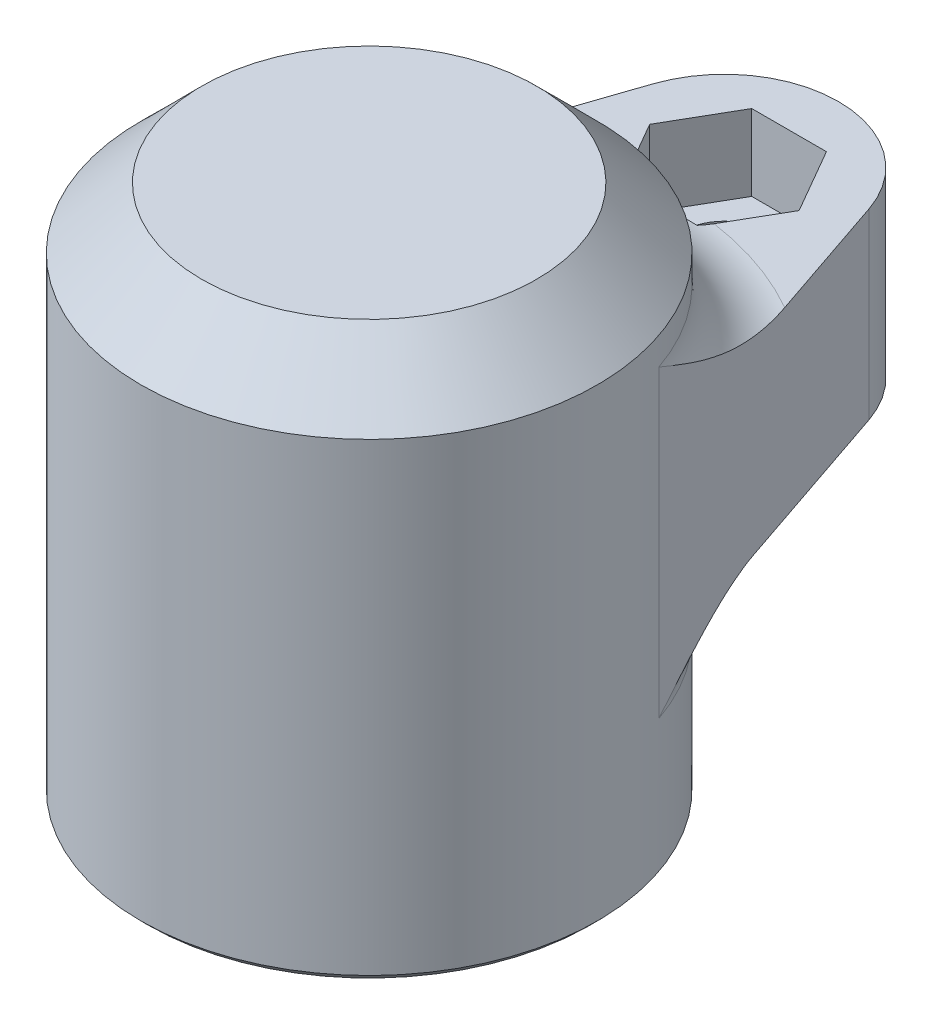
ISO-10303-21;
HEADER;
FILE_DESCRIPTION(('STEP AP214'),'2;1');
FILE_NAME('part.step','',(''),(''),'','','');
FILE_SCHEMA(('AUTOMOTIVE_DESIGN { 1 0 10303 214 1 1 1 1 }'));
ENDSEC;
DATA;
#1=APPLICATION_CONTEXT('core data for automotive mechanical design processes');
#2=APPLICATION_PROTOCOL_DEFINITION('international standard','automotive_design',2000,#1);
#3=PRODUCT_CONTEXT('',#1,'mechanical');
#4=PRODUCT('Part','Part','',(#3));
#5=PRODUCT_RELATED_PRODUCT_CATEGORY('part','',(#4));
#6=PRODUCT_DEFINITION_FORMATION('','',#4);
#7=PRODUCT_DEFINITION_CONTEXT('part definition',#1,'design');
#8=PRODUCT_DEFINITION('design','',#6,#7);
#9=PRODUCT_DEFINITION_SHAPE('','',#8);
#10=(LENGTH_UNIT() NAMED_UNIT(*) SI_UNIT(.MILLI.,.METRE.));
#11=(NAMED_UNIT(*) PLANE_ANGLE_UNIT() SI_UNIT($,.RADIAN.));
#12=(NAMED_UNIT(*) SI_UNIT($,.STERADIAN.) SOLID_ANGLE_UNIT());
#13=UNCERTAINTY_MEASURE_WITH_UNIT(LENGTH_MEASURE(1.E-05),#10,'distance_accuracy_value','');
#14=(GEOMETRIC_REPRESENTATION_CONTEXT(3) GLOBAL_UNCERTAINTY_ASSIGNED_CONTEXT((#13)) GLOBAL_UNIT_ASSIGNED_CONTEXT((#10,
#11,#12)) REPRESENTATION_CONTEXT('',''));
#15=CARTESIAN_POINT('',(0.,0.,0.));
#16=DIRECTION('',(0.,0.,1.));
#17=DIRECTION('',(1.,0.,0.));
#18=AXIS2_PLACEMENT_3D('',#15,#16,#17);
#19=CARTESIAN_POINT('',(0.,12.2,-23.3362854192114));
#20=DIRECTION('',(0.,1.,0.));
#21=DIRECTION('',(0.,0.,1.));
#22=AXIS2_PLACEMENT_3D('',#19,#20,#21);
#23=PLANE('',#22);
#24=DIRECTION('',(-0.321387910083826,0.,-0.946947628568735));
#25=VECTOR('',#24,1.);
#26=CARTESIAN_POINT('',(7.10210721426551,12.2,-25.7466947448401));
#27=LINE('',#26,#25);
#28=CARTESIAN_POINT('',(11.0064450988174,12.2,-14.2428285914954));
#29=VERTEX_POINT('',#28);
#30=CARTESIAN_POINT('',(7.10210721426551,12.2,-25.7466947448401));
#31=VERTEX_POINT('',#30);
#32=EDGE_CURVE('E213',#29,#31,#27,.T.);
#33=ORIENTED_EDGE('',*,*,#32,.F.);
#34=CARTESIAN_POINT('',(0.,12.2,0.));
#35=DIRECTION('',(0.,1.,0.));
#36=DIRECTION('',(0.,0.,1.));
#37=AXIS2_PLACEMENT_3D('',#34,#35,#36);
#38=CIRCLE('',#37,18.);
#39=CARTESIAN_POINT('',(4.59008360968517,12.2,-17.404916904602));
#40=VERTEX_POINT('',#39);
#41=EDGE_CURVE('E290',#29,#40,#38,.T.);
#42=ORIENTED_EDGE('',*,*,#41,.T.);
#43=CARTESIAN_POINT('',(0.,12.2,-23.3362854192114));
#44=DIRECTION('',(0.,-1.,0.));
#45=DIRECTION('',(0.,0.,1.));
#46=AXIS2_PLACEMENT_3D('',#43,#44,#45);
#47=CIRCLE('',#46,7.5);
#48=EDGE_CURVE('E207',#31,#40,#47,.T.);
#49=ORIENTED_EDGE('',*,*,#48,.F.);
#50=EDGE_LOOP('',(#33,#42,#49));
#51=FACE_BOUND('',#50,.T.);
#52=ADVANCED_FACE('F37',(#51),#23,.F.);
#53=CARTESIAN_POINT('',(0.,24.2,-23.3362854192114));
#54=DIRECTION('',(0.,1.,0.));
#55=DIRECTION('',(0.,0.,1.));
#56=AXIS2_PLACEMENT_3D('',#53,#54,#55);
#57=PLANE('',#56);
#58=DIRECTION('',(0.5,0.,0.866025403784439));
#59=VECTOR('',#58,1.);
#60=CARTESIAN_POINT('',(3.68060796608386,24.2,-25.4612854192114));
#61=LINE('',#60,#59);
#62=CARTESIAN_POINT('',(2.4537386440559,24.2,-27.5862854192114));
#63=VERTEX_POINT('',#62);
#64=CARTESIAN_POINT('',(4.90747728811182,24.2,-23.3362854192114));
#65=VERTEX_POINT('',#64);
#66=EDGE_CURVE('E341',#63,#65,#61,.T.);
#67=ORIENTED_EDGE('',*,*,#66,.T.);
#68=DIRECTION('',(-0.5,0.,0.866025403784439));
#69=VECTOR('',#68,1.);
#70=CARTESIAN_POINT('',(3.68060796608387,24.2,-21.2112854192114));
#71=LINE('',#70,#69);
#72=CARTESIAN_POINT('',(2.86239957666177,24.2,-19.7941069175532));
#73=VERTEX_POINT('',#72);
#74=EDGE_CURVE('E153',#65,#73,#71,.T.);
#75=ORIENTED_EDGE('',*,*,#74,.T.);
#76=CARTESIAN_POINT('',(0.,24.2,0.));
#77=DIRECTION('',(0.,1.,0.));
#78=DIRECTION('',(0.,0.,1.));
#79=AXIS2_PLACEMENT_3D('',#76,#77,#78);
#80=CIRCLE('',#79,20.);
#81=CARTESIAN_POINT('',(9.95265200620806,24.2,-17.3477583002336));
#82=VERTEX_POINT('',#81);
#83=EDGE_CURVE('E241',#73,#82,#80,.F.);
#84=ORIENTED_EDGE('',*,*,#83,.T.);
#85=DIRECTION('',(-0.321387910083826,0.,-0.946947628568735));
#86=VECTOR('',#85,1.);
#87=CARTESIAN_POINT('',(7.10210721426551,24.2,-25.7466947448401));
#88=LINE('',#87,#86);
#89=CARTESIAN_POINT('',(7.10210721426551,24.2,-25.7466947448401));
#90=VERTEX_POINT('',#89);
#91=EDGE_CURVE('E218',#82,#90,#88,.T.);
#92=ORIENTED_EDGE('',*,*,#91,.T.);
#93=CARTESIAN_POINT('',(0.,24.2,-23.3362854192114));
#94=DIRECTION('',(0.,1.,0.));
#95=DIRECTION('',(0.,0.,1.));
#96=AXIS2_PLACEMENT_3D('',#93,#94,#95);
#97=CIRCLE('',#96,7.5);
#98=CARTESIAN_POINT('',(-7.10210721426551,24.2,-25.7466947448401));
#99=VERTEX_POINT('',#98);
#100=EDGE_CURVE('E198',#90,#99,#97,.T.);
#101=ORIENTED_EDGE('',*,*,#100,.T.);
#102=DIRECTION('',(-0.321387910083826,0.,0.946947628568735));
#103=VECTOR('',#102,1.);
#104=CARTESIAN_POINT('',(-7.10210721426551,24.2,-25.7466947448401));
#105=LINE('',#104,#103);
#106=CARTESIAN_POINT('',(-9.95265200620807,24.2,-17.3477583002336));
#107=VERTEX_POINT('',#106);
#108=EDGE_CURVE('E206',#99,#107,#105,.T.);
#109=ORIENTED_EDGE('',*,*,#108,.T.);
#110=CARTESIAN_POINT('',(-2.86239957666177,24.2,-19.7941069175532));
#111=VERTEX_POINT('',#110);
#112=EDGE_CURVE('E242',#107,#111,#80,.F.);
#113=ORIENTED_EDGE('',*,*,#112,.T.);
#114=DIRECTION('',(-0.5,0.,-0.866025403784439));
#115=VECTOR('',#114,1.);
#116=CARTESIAN_POINT('',(-3.68060796608387,24.2,-21.2112854192114));
#117=LINE('',#116,#115);
#118=CARTESIAN_POINT('',(-4.90747728811182,24.2,-23.3362854192114));
#119=VERTEX_POINT('',#118);
#120=EDGE_CURVE('E156',#111,#119,#117,.T.);
#121=ORIENTED_EDGE('',*,*,#120,.T.);
#122=DIRECTION('',(0.5,0.,-0.866025403784439));
#123=VECTOR('',#122,1.);
#124=CARTESIAN_POINT('',(-3.68060796608387,24.2,-25.4612854192114));
#125=LINE('',#124,#123);
#126=CARTESIAN_POINT('',(-2.45373864405591,24.2,-27.5862854192114));
#127=VERTEX_POINT('',#126);
#128=EDGE_CURVE('E346',#119,#127,#125,.T.);
#129=ORIENTED_EDGE('',*,*,#128,.T.);
#130=DIRECTION('',(1.,0.,0.));
#131=VECTOR('',#130,1.);
#132=CARTESIAN_POINT('',(0.,24.2,-27.5862854192114));
#133=LINE('',#132,#131);
#134=EDGE_CURVE('E343',#127,#63,#133,.T.);
#135=ORIENTED_EDGE('',*,*,#134,.T.);
#136=EDGE_LOOP('',(#67,#75,#84,#92,#101,#109,#113,#121,#129,#135));
#137=FACE_BOUND('',#136,.T.);
#138=ADVANCED_FACE('F273',(#137),#57,.T.);
#139=CARTESIAN_POINT('',(0.,9.19999999999998,-23.3362854192114));
#140=DIRECTION('',(0.,1.,0.));
#141=DIRECTION('',(0.,0.,1.));
#142=AXIS2_PLACEMENT_3D('',#139,#140,#141);
#143=CYLINDRICAL_SURFACE('',#142,2.75);
#144=CARTESIAN_POINT('',(0.,9.19999999999998,-23.3362854192114));
#145=DIRECTION('',(0.,1.,0.));
#146=DIRECTION('',(0.,0.,1.));
#147=AXIS2_PLACEMENT_3D('',#144,#145,#146);
#148=CIRCLE('',#147,2.75);
#149=CARTESIAN_POINT('',(0.,9.19999999999998,-20.5862854192114));
#150=VERTEX_POINT('',#149);
#151=EDGE_CURVE('E195',#150,#150,#148,.T.);
#152=ORIENTED_EDGE('',*,*,#151,.F.);
#153=EDGE_LOOP('',(#152));
#154=FACE_BOUND('',#153,.T.);
#155=CARTESIAN_POINT('',(0.,19.2,-23.3362854192114));
#156=DIRECTION('',(0.,1.,0.));
#157=DIRECTION('',(0.,0.,1.));
#158=AXIS2_PLACEMENT_3D('',#155,#156,#157);
#159=CIRCLE('',#158,2.75);
#160=CARTESIAN_POINT('',(0.,19.2,-20.5862854192114));
#161=VERTEX_POINT('',#160);
#162=EDGE_CURVE('E194',#161,#161,#159,.F.);
#163=ORIENTED_EDGE('',*,*,#162,.F.);
#164=EDGE_LOOP('',(#163));
#165=FACE_BOUND('',#164,.T.);
#166=ADVANCED_FACE('F317',(#154,#165),#143,.F.);
#167=CARTESIAN_POINT('',(0.,29.2,0.));
#168=DIRECTION('',(0.,1.,0.));
#169=DIRECTION('',(0.,0.,1.));
#170=AXIS2_PLACEMENT_3D('',#167,#168,#169);
#171=TOROIDAL_SURFACE('',#170,20.,5.);
#172=CARTESIAN_POINT('',(2.45362317400208,24.2576137276483,-19.0860854192114));
#173=CARTESIAN_POINT('',(2.54096936932443,24.2329237732383,-19.2373734673575));
#174=CARTESIAN_POINT('',(2.62884300752122,24.2161146484028,-19.3895750733603));
#175=CARTESIAN_POINT('',(2.76090240583948,24.2028839694649,-19.6183086608645));
#176=CARTESIAN_POINT('',(2.80494708588814,24.2004695694318,-19.6945962845119));
#177=CARTESIAN_POINT('',(2.89313631471571,24.1996535131138,-19.8473445095216));
#178=CARTESIAN_POINT('',(2.93728088244846,24.2012601268011,-19.9238051437128));
#179=CARTESIAN_POINT('',(2.98138747329056,24.2048950577898,-20.0002));
#180=B_SPLINE_CURVE_WITH_KNOTS('',3,(#172,#173,#174,#175,#176,#177,#178,#179),.UNSPECIFIED.,.F.,
.F.,(4,2,2,4),(0.,0.528962038003644,0.793244366994631,1.05807068886575),.UNSPECIFIED.);
#181=CARTESIAN_POINT('',(2.45373864405591,24.2575811008859,-19.0862854192114));
#182=VERTEX_POINT('',#181);
#183=EDGE_CURVE('E349',#182,#73,#180,.T.);
#184=ORIENTED_EDGE('',*,*,#183,.F.);
#185=CARTESIAN_POINT('',(-11.7936811590002,24.8335865651276,-19.0862854192114));
#186=CARTESIAN_POINT('',(-11.6680707564016,24.7967529546403,-19.0862854192114));
#187=CARTESIAN_POINT('',(-11.5418346529446,24.7621167766519,-19.0862854192114));
#188=CARTESIAN_POINT('',(-11.2883351316032,24.6969361205703,-19.0862854192114));
#189=CARTESIAN_POINT('',(-11.1610719215668,24.6663908356062,-19.0862854192114));
#190=CARTESIAN_POINT('',(-10.7783021827309,24.5804835197622,-19.0862854192114));
#191=CARTESIAN_POINT('',(-10.5215201407236,24.5307651422823,-19.0862854192114));
#192=CARTESIAN_POINT('',(-10.0076291827764,24.4444673495491,-19.0862854192114));
#193=CARTESIAN_POINT('',(-9.75053462694888,24.4078000317794,-19.0862854192114));
#194=CARTESIAN_POINT('',(-9.23498785705955,24.345132076347,-19.0862854192114));
#195=CARTESIAN_POINT('',(-8.97653523971071,24.3191348124755,-19.0862854192114));
#196=CARTESIAN_POINT('',(-8.45968675587288,24.2760795881361,-19.0862854192114));
#197=CARTESIAN_POINT('',(-8.20129303314161,24.2589951147569,-19.0862854192114));
#198=CARTESIAN_POINT('',(-7.68417251670884,24.2320071389797,-19.0862854192114));
#199=CARTESIAN_POINT('',(-7.42544576119804,24.2221028759267,-19.0862854192114));
#200=CARTESIAN_POINT('',(-6.90730338945902,24.2079471441118,-19.0862854192114));
#201=CARTESIAN_POINT('',(-6.6478874695045,24.2037076169565,-19.0862854192114));
#202=CARTESIAN_POINT('',(-6.12901476717153,24.1995218221235,-19.0862854192114));
#203=CARTESIAN_POINT('',(-5.8695579833651,24.1995757791356,-19.0862854192114));
#204=CARTESIAN_POINT('',(-5.24775004649337,24.2033005287797,-19.0862854192114));
#205=CARTESIAN_POINT('',(-4.88540976828166,24.2083975637889,-19.0862854192114));
#206=CARTESIAN_POINT('',(-4.16077354629952,24.2213055886373,-19.0862854192114));
#207=CARTESIAN_POINT('',(-3.7984776046648,24.2291166788591,-19.0862854192114));
#208=CARTESIAN_POINT('',(-3.07394272493618,24.2448127091775,-19.0862854192114));
#209=CARTESIAN_POINT('',(-2.71170378667636,24.2526976376876,-19.0862854192114));
#210=CARTESIAN_POINT('',(-1.98719277759634,24.2664861283462,-19.0862854192114));
#211=CARTESIAN_POINT('',(-1.62492070763689,24.2723897323136,-19.0862854192114));
#212=CARTESIAN_POINT('',(-0.900792100393663,24.2808547579693,-19.0862854192114));
#213=CARTESIAN_POINT('',(-0.538935616221354,24.28342039171,-19.0862854192114));
#214=CARTESIAN_POINT('',(0.184783935952979,24.2846670676143,-19.0862854192114));
#215=CARTESIAN_POINT('',(0.546647003943103,24.2833481162132,-19.0862854192114));
#216=CARTESIAN_POINT('',(1.27057481191431,24.2771074557774,-19.0862854192114));
#217=CARTESIAN_POINT('',(1.63263953018402,24.2721834067003,-19.0862854192114));
#218=CARTESIAN_POINT('',(2.35673105206947,24.2598323691512,-19.0862854192114));
#219=CARTESIAN_POINT('',(2.71875785462988,24.2524053234932,-19.0862854192114));
#220=CARTESIAN_POINT('',(3.44495149858086,24.2368380603076,-19.0862854192114));
#221=CARTESIAN_POINT('',(3.80911824573162,24.2286938592288,-19.0862854192114));
#222=CARTESIAN_POINT('',(4.53747647068026,24.2142325881838,-19.0862854192114));
#223=CARTESIAN_POINT('',(4.90166794664881,24.2079154366809,-19.0862854192114));
#224=CARTESIAN_POINT('',(5.62940278255606,24.2001441639772,-19.0862854192114));
#225=CARTESIAN_POINT('',(5.9929460141429,24.1986805381044,-19.0862854192114));
#226=CARTESIAN_POINT('',(6.72007634782834,24.2040551200396,-19.0862854192114));
#227=CARTESIAN_POINT('',(7.0836634434949,24.2108950413788,-19.0862854192114));
#228=CARTESIAN_POINT('',(7.81205639255447,24.236841791603,-19.0862854192114));
#229=CARTESIAN_POINT('',(8.1768604758937,24.2560030339825,-19.0862854192114));
#230=CARTESIAN_POINT('',(8.90506597352423,24.3110669356362,-19.0862854192114));
#231=CARTESIAN_POINT('',(9.26846815998236,24.34695844028,-19.0862854192114));
#232=CARTESIAN_POINT('',(9.81286435959156,24.4172921462392,-19.0862854192114));
#233=CARTESIAN_POINT('',(9.99491241426469,24.4436199309137,-19.0862854192114));
#234=CARTESIAN_POINT('',(10.3579823623997,24.5025145579196,-19.0862854192114));
#235=CARTESIAN_POINT('',(10.5390043883597,24.5350805748516,-19.0862854192114));
#236=CARTESIAN_POINT('',(10.9000928112816,24.6072909112891,-19.0862854192114));
#237=CARTESIAN_POINT('',(11.080155936083,24.6469517873057,-19.0862854192114));
#238=CARTESIAN_POINT('',(11.4384491478189,24.7341518844638,-19.0862854192114));
#239=CARTESIAN_POINT('',(11.6166783099876,24.7816948914423,-19.0862854192114));
#240=CARTESIAN_POINT('',(11.7936811590002,24.8335865651276,-19.0862854192114));
#241=B_SPLINE_CURVE_WITH_KNOTS('',3,(#185,#186,#187,#188,#189,#190,#191,#192,#193,#194,#195,
#196,#197,#198,#199,#200,#201,#202,#203,#204,#205,#206,#207,#208,#209,#210,#211,#212,#213,#214,
#215,#216,#217,#218,#219,#220,#221,#222,#223,#224,#225,#226,#227,#228,#229,#230,#231,#232,#233,
#234,#235,#236,#237,#238,#239,#240),.UNSPECIFIED.,.F.,.F.,(4,2,2,2,2,2,2,2,2,2,2,2,2,2,2,2,2,2,
2,2,2,2,2,2,2,2,2,4),(0.,0.3926497049784,0.785221850944467,1.56944565354764,2.34828282085053,
3.12736606126655,3.90411835160807,4.68078834254829,5.45909303131867,6.23743845090678,
7.32453933192224,8.41168042495266,9.49865369257952,10.5856040165284,11.6711814263514,
12.7567570377808,13.8430379137652,14.9293436097046,16.0221182398174,17.1148440946156,
18.2054287938018,19.2962385857803,20.3918990142359,21.4868299715119,22.0385666161454,
22.5902303091856,23.143198565328,23.6964331891526),.UNSPECIFIED.);
#242=CARTESIAN_POINT('',(-2.45373864405591,24.2575811008858,-19.0862854192114));
#243=VERTEX_POINT('',#242);
#244=EDGE_CURVE('E392',#243,#182,#241,.T.);
#245=ORIENTED_EDGE('',*,*,#244,.F.);
#246=CARTESIAN_POINT('',(-2.98138747329056,24.2048950577898,-20.0002));
#247=CARTESIAN_POINT('',(-2.93728088244846,24.2012601268011,-19.9238051437128));
#248=CARTESIAN_POINT('',(-2.89313631471572,24.1996535131138,-19.8473445095216));
#249=CARTESIAN_POINT('',(-2.80494708588814,24.2004695694318,-19.6945962845119));
#250=CARTESIAN_POINT('',(-2.76090240583948,24.2028839694649,-19.6183086608645));
#251=CARTESIAN_POINT('',(-2.62884300752122,24.2161146484028,-19.3895750733603));
#252=CARTESIAN_POINT('',(-2.54096936932443,24.2329237732383,-19.2373734673575));
#253=CARTESIAN_POINT('',(-2.45362317400208,24.2576137276483,-19.0860854192114));
#254=B_SPLINE_CURVE_WITH_KNOTS('',3,(#246,#247,#248,#249,#250,#251,#252,#253),.UNSPECIFIED.,.F.,
.F.,(4,2,2,4),(0.,0.264826321871113,0.529108650862104,1.05807068886575),.UNSPECIFIED.);
#255=EDGE_CURVE('E358',#111,#243,#254,.T.);
#256=ORIENTED_EDGE('',*,*,#255,.F.);
#257=ORIENTED_EDGE('',*,*,#112,.F.);
#258=CARTESIAN_POINT('',(-9.95265200620807,24.2,-17.3477583002336));
#259=CARTESIAN_POINT('',(-10.0133624043205,24.2000065016154,-17.1688792393907));
#260=CARTESIAN_POINT('',(-10.0740569697032,24.204682625303,-16.9900468286097));
#261=CARTESIAN_POINT('',(-10.1952921397578,24.2227376651448,-16.6328356418155));
#262=CARTESIAN_POINT('',(-10.2558327915163,24.2361134849686,-16.454456727065));
#263=CARTESIAN_POINT('',(-10.4368364358837,24.2882643313908,-15.9211417938702));
#264=CARTESIAN_POINT('',(-10.5569521177799,24.3390684992394,-15.56722910283));
#265=CARTESIAN_POINT('',(-10.7938830776832,24.4672709473727,-14.8691281364419));
#266=CARTESIAN_POINT('',(-10.9107209845912,24.5442776494668,-14.524873186576));
#267=CARTESIAN_POINT('',(-11.1426440988689,24.721200832164,-13.8415274968818));
#268=CARTESIAN_POINT('',(-11.2577282468817,24.8211306166712,-13.502439878377));
#269=CARTESIAN_POINT('',(-11.4965921658248,25.0506514724933,-12.7986435795841));
#270=CARTESIAN_POINT('',(-11.6201820111108,25.1821395744848,-12.4344945022955));
#271=CARTESIAN_POINT('',(-11.8650838157817,25.4643974622564,-11.7129079836711));
#272=CARTESIAN_POINT('',(-11.986395109496,25.615172785256,-11.3554725036888));
#273=CARTESIAN_POINT('',(-12.226950912917,25.9325801115012,-10.6466911822988));
#274=CARTESIAN_POINT('',(-12.3461937471546,26.0992243189964,-10.295350277547));
#275=CARTESIAN_POINT('',(-12.5827783600394,26.4451523270605,-9.59826979910374));
#276=CARTESIAN_POINT('',(-12.7001198696576,26.6244378974479,-9.25253101808791));
#277=CARTESIAN_POINT('',(-13.0512024110019,27.1792235769909,-8.21809017720149));
#278=CARTESIAN_POINT('',(-13.2825009431981,27.5695901823305,-7.53658477615043));
#279=CARTESIAN_POINT('',(-13.7416702856898,28.3691893281181,-6.18367352360655));
#280=CARTESIAN_POINT('',(-13.9695403294383,28.7784260068157,-5.51226993069208));
#281=CARTESIAN_POINT('',(-14.1996693167663,29.1918350344452,-4.83421051408767));
#282=CARTESIAN_POINT('',(-14.2019418724694,29.1959175173674,-4.82751458320069));
#283=CARTESIAN_POINT('',(-14.204214428531,29.2,-4.82081865125739));
#284=B_SPLINE_CURVE_WITH_KNOTS('',3,(#258,#259,#260,#261,#262,#263,#264,#265,#266,#267,#268,
#269,#270,#271,#272,#273,#274,#275,#276,#277,#278,#279,#280,#281,#282,#283),.UNSPECIFIED.,.F.,
.F.,(4,2,2,2,2,2,2,2,2,2,2,2,4),(0.,0.566563519169043,1.13292550158528,2.2631287663016,
3.37713412386952,4.49178766154956,5.71038884679979,6.92934067199363,8.14923764377627,
9.36930574421399,11.824729368979,14.2806940587855,14.3051889562154),.UNSPECIFIED.);
#285=CARTESIAN_POINT('',(-14.204214428531,29.2,-4.82081865125739));
#286=VERTEX_POINT('',#285);
#287=EDGE_CURVE('E257',#286,#107,#284,.F.);
#288=ORIENTED_EDGE('',*,*,#287,.F.);
#289=CARTESIAN_POINT('',(0.,29.2,0.));
#290=DIRECTION('',(0.,1.,0.));
#291=DIRECTION('',(0.,0.,1.));
#292=AXIS2_PLACEMENT_3D('',#289,#290,#291);
#293=CIRCLE('',#292,15.);
#294=CARTESIAN_POINT('',(14.204214428531,29.2,-4.82081865125739));
#295=VERTEX_POINT('',#294);
#296=EDGE_CURVE('E245',#295,#286,#293,.T.);
#297=ORIENTED_EDGE('',*,*,#296,.F.);
#298=CARTESIAN_POINT('',(9.95265200620806,24.2,-17.3477583002336));
#299=CARTESIAN_POINT('',(10.0133624043214,24.2000065016154,-17.1688792393882));
#300=CARTESIAN_POINT('',(10.0740569697049,24.2046826253032,-16.9900468286047));
#301=CARTESIAN_POINT('',(10.1952921397612,24.2227376651454,-16.6328356418055));
#302=CARTESIAN_POINT('',(10.2558327915205,24.2361134849696,-16.4544567270525));
#303=CARTESIAN_POINT('',(10.43683643589,24.2882643313931,-15.9211417938514));
#304=CARTESIAN_POINT('',(10.5569521177875,24.3390684992428,-15.5672291028074));
#305=CARTESIAN_POINT('',(10.7938830776905,24.4672709473774,-14.8691281364204));
#306=CARTESIAN_POINT('',(10.9107209845968,24.5442776494708,-14.5248731865593));
#307=CARTESIAN_POINT('',(11.1426440988716,24.7212008321663,-13.8415274968739));
#308=CARTESIAN_POINT('',(11.257728246883,24.8211306166725,-13.5024398783731));
#309=CARTESIAN_POINT('',(11.4965921658245,25.050651472493,-12.7986435795849));
#310=CARTESIAN_POINT('',(11.6201820111102,25.1821395744841,-12.4344945022971));
#311=CARTESIAN_POINT('',(11.8650838157807,25.4643974622553,-11.712907983674));
#312=CARTESIAN_POINT('',(11.9863951094948,25.6151727852548,-11.3554725036922));
#313=CARTESIAN_POINT('',(12.2269509129151,25.9325801114983,-10.6466911823043));
#314=CARTESIAN_POINT('',(12.3461937471522,26.0992243189919,-10.2953502775541));
#315=CARTESIAN_POINT('',(12.5827783600355,26.4451523270557,-9.59826979911545));
#316=CARTESIAN_POINT('',(12.7001198696526,26.6244378974444,-9.25253101810258));
#317=CARTESIAN_POINT('',(13.0512024109989,27.1792235769774,-8.21809017721041));
#318=CARTESIAN_POINT('',(13.2825009432012,27.5695901822888,-7.53658477614144));
#319=CARTESIAN_POINT('',(13.7416702856812,28.3691893281504,-6.18367352363152));
#320=CARTESIAN_POINT('',(13.9695403294119,28.7784260069501,-5.51226993076896));
#321=CARTESIAN_POINT('',(14.1996693167659,29.1918350344481,-4.83421051408891));
#322=CARTESIAN_POINT('',(14.2019418724692,29.1959175173688,-4.82751458320132));
#323=CARTESIAN_POINT('',(14.204214428531,29.2,-4.82081865125739));
#324=B_SPLINE_CURVE_WITH_KNOTS('',3,(#298,#299,#300,#301,#302,#303,#304,#305,#306,#307,#308,
#309,#310,#311,#312,#313,#314,#315,#316,#317,#318,#319,#320,#321,#322,#323),.UNSPECIFIED.,.F.,
.F.,(4,2,2,2,2,2,2,2,2,2,2,2,4),(0.,0.566563519176945,1.1329255016011,2.26312876632977,
3.3771341238825,4.49178766154954,5.71038884679712,6.92934067198942,8.14923764376514,
9.36930574419676,11.8247293689687,14.2806940587859,14.3051889562154),.UNSPECIFIED.);
#325=EDGE_CURVE('E248',#82,#295,#324,.T.);
#326=ORIENTED_EDGE('',*,*,#325,.F.);
#327=ORIENTED_EDGE('',*,*,#83,.F.);
#328=EDGE_LOOP('',(#184,#245,#256,#257,#288,#297,#326,#327));
#329=FACE_BOUND('',#328,.T.);
#330=ADVANCED_FACE('F263',(#329),#171,.F.);
#331=CARTESIAN_POINT('',(0.,35.,0.));
#332=DIRECTION('',(0.,-1.,0.));
#333=DIRECTION('',(0.,0.,-1.));
#334=AXIS2_PLACEMENT_3D('',#331,#332,#333);
#335=CYLINDRICAL_SURFACE('',#334,15.);
#336=CARTESIAN_POINT('',(0.,0.500000000000007,0.));
#337=DIRECTION('',(0.,1.,0.));
#338=DIRECTION('',(0.,0.,1.));
#339=AXIS2_PLACEMENT_3D('',#336,#337,#338);
#340=CIRCLE('',#339,15.);
#341=CARTESIAN_POINT('',(0.,0.500000000000007,15.));
#342=VERTEX_POINT('',#341);
#343=EDGE_CURVE('E332',#342,#342,#340,.T.);
#344=ORIENTED_EDGE('',*,*,#343,.T.);
#345=EDGE_LOOP('',(#344));
#346=FACE_BOUND('',#345,.T.);
#347=CARTESIAN_POINT('',(0.,31.,0.));
#348=DIRECTION('',(0.,1.,0.));
#349=DIRECTION('',(0.,0.,1.));
#350=AXIS2_PLACEMENT_3D('',#347,#348,#349);
#351=CIRCLE('',#350,15.);
#352=CARTESIAN_POINT('',(0.,31.,15.));
#353=VERTEX_POINT('',#352);
#354=EDGE_CURVE('E335',#353,#353,#351,.F.);
#355=ORIENTED_EDGE('',*,*,#354,.T.);
#356=EDGE_LOOP('',(#355));
#357=FACE_BOUND('',#356,.T.);
#358=CARTESIAN_POINT('',(0.,9.19999999999998,0.));
#359=DIRECTION('',(0.,1.,0.));
#360=DIRECTION('',(0.,0.,1.));
#361=AXIS2_PLACEMENT_3D('',#358,#359,#360);
#362=CIRCLE('',#361,15.);
#363=CARTESIAN_POINT('',(-14.204214428531,9.19999999999998,-4.82081865125739));
#364=VERTEX_POINT('',#363);
#365=CARTESIAN_POINT('',(14.204214428531,9.19999999999998,-4.82081865125739));
#366=VERTEX_POINT('',#365);
#367=EDGE_CURVE('E326',#364,#366,#362,.F.);
#368=ORIENTED_EDGE('',*,*,#367,.T.);
#369=DIRECTION('',(0.,1.,0.));
#370=VECTOR('',#369,1.);
#371=CARTESIAN_POINT('',(14.204214428531,12.2,-4.82081865125739));
#372=LINE('',#371,#370);
#373=EDGE_CURVE('E224',#366,#295,#372,.T.);
#374=ORIENTED_EDGE('',*,*,#373,.T.);
#375=ORIENTED_EDGE('',*,*,#296,.T.);
#376=DIRECTION('',(0.,1.,0.));
#377=VECTOR('',#376,1.);
#378=CARTESIAN_POINT('',(-14.204214428531,12.2,-4.82081865125739));
#379=LINE('',#378,#377);
#380=EDGE_CURVE('E226',#364,#286,#379,.T.);
#381=ORIENTED_EDGE('',*,*,#380,.F.);
#382=EDGE_LOOP('',(#368,#374,#375,#381));
#383=FACE_BOUND('',#382,.T.);
#384=ADVANCED_FACE('F424',(#346,#357,#383),#335,.T.);
#385=CARTESIAN_POINT('',(0.,35.,0.));
#386=DIRECTION('',(0.,1.,0.));
#387=DIRECTION('',(0.,0.,1.));
#388=AXIS2_PLACEMENT_3D('',#385,#386,#387);
#389=PLANE('',#388);
#390=CARTESIAN_POINT('',(0.,35.,0.));
#391=DIRECTION('',(0.,1.,0.));
#392=DIRECTION('',(0.,0.,1.));
#393=AXIS2_PLACEMENT_3D('',#390,#391,#392);
#394=CIRCLE('',#393,11.);
#395=CARTESIAN_POINT('',(0.,35.,11.));
#396=VERTEX_POINT('',#395);
#397=EDGE_CURVE('E338',#396,#396,#394,.T.);
#398=ORIENTED_EDGE('',*,*,#397,.T.);
#399=EDGE_LOOP('',(#398));
#400=FACE_BOUND('',#399,.T.);
#401=ADVANCED_FACE('F426',(#400),#389,.T.);
#402=CARTESIAN_POINT('',(0.,0.,0.));
#403=DIRECTION('',(0.,1.,0.));
#404=DIRECTION('',(0.,0.,1.));
#405=AXIS2_PLACEMENT_3D('',#402,#403,#404);
#406=PLANE('',#405);
#407=CARTESIAN_POINT('',(0.,0.,0.));
#408=DIRECTION('',(0.,1.,0.));
#409=DIRECTION('',(0.,0.,1.));
#410=AXIS2_PLACEMENT_3D('',#407,#408,#409);
#411=CIRCLE('',#410,14.5);
#412=CARTESIAN_POINT('',(0.,0.,14.5));
#413=VERTEX_POINT('',#412);
#414=EDGE_CURVE('E327',#413,#413,#411,.F.);
#415=ORIENTED_EDGE('',*,*,#414,.T.);
#416=EDGE_LOOP('',(#415));
#417=FACE_BOUND('',#416,.T.);
#418=CARTESIAN_POINT('',(0.,0.,0.));
#419=DIRECTION('',(0.,1.,0.));
#420=DIRECTION('',(0.,0.,1.));
#421=AXIS2_PLACEMENT_3D('',#418,#419,#420);
#422=CIRCLE('',#421,12.);
#423=CARTESIAN_POINT('',(0.,0.,12.));
#424=VERTEX_POINT('',#423);
#425=EDGE_CURVE('E238',#424,#424,#422,.T.);
#426=ORIENTED_EDGE('',*,*,#425,.T.);
#427=EDGE_LOOP('',(#426));
#428=FACE_BOUND('',#427,.T.);
#429=ADVANCED_FACE('F432',(#417,#428),#406,.F.);
#430=CARTESIAN_POINT('',(0.,30.,0.));
#431=DIRECTION('',(0.,1.,0.));
#432=DIRECTION('',(0.,0.,1.));
#433=AXIS2_PLACEMENT_3D('',#430,#431,#432);
#434=CYLINDRICAL_SURFACE('',#433,12.);
#435=CARTESIAN_POINT('',(0.,5.,0.));
#436=DIRECTION('',(0.,1.,0.));
#437=DIRECTION('',(0.,0.,1.));
#438=AXIS2_PLACEMENT_3D('',#435,#436,#437);
#439=CIRCLE('',#438,12.);
#440=CARTESIAN_POINT('',(0.,5.,12.));
#441=VERTEX_POINT('',#440);
#442=EDGE_CURVE('E235',#441,#441,#439,.T.);
#443=ORIENTED_EDGE('',*,*,#442,.T.);
#444=EDGE_LOOP('',(#443));
#445=FACE_BOUND('',#444,.T.);
#446=ORIENTED_EDGE('',*,*,#425,.F.);
#447=EDGE_LOOP('',(#446));
#448=FACE_BOUND('',#447,.T.);
#449=ADVANCED_FACE('F438',(#445,#448),#434,.F.);
#450=CARTESIAN_POINT('',(0.,5.,0.));
#451=DIRECTION('',(0.,-1.,0.));
#452=DIRECTION('',(0.,0.,-1.));
#453=AXIS2_PLACEMENT_3D('',#450,#451,#452);
#454=CONICAL_SURFACE('',#453,12.,0.78539816339745);
#455=CARTESIAN_POINT('',(0.,11.5,0.));
#456=DIRECTION('',(0.,1.,0.));
#457=DIRECTION('',(0.,0.,1.));
#458=AXIS2_PLACEMENT_3D('',#455,#456,#457);
#459=CIRCLE('',#458,5.5);
#460=CARTESIAN_POINT('',(0.,11.5,5.5));
#461=VERTEX_POINT('',#460);
#462=EDGE_CURVE('E232',#461,#461,#459,.T.);
#463=ORIENTED_EDGE('',*,*,#462,.T.);
#464=EDGE_LOOP('',(#463));
#465=FACE_BOUND('',#464,.T.);
#466=ORIENTED_EDGE('',*,*,#442,.F.);
#467=EDGE_LOOP('',(#466));
#468=FACE_BOUND('',#467,.T.);
#469=ADVANCED_FACE('F443',(#465,#468),#454,.F.);
#470=CARTESIAN_POINT('',(0.,30.,0.));
#471=DIRECTION('',(0.,1.,0.));
#472=DIRECTION('',(0.,0.,1.));
#473=AXIS2_PLACEMENT_3D('',#470,#471,#472);
#474=CYLINDRICAL_SURFACE('',#473,5.5);
#475=CARTESIAN_POINT('',(0.,30.,0.));
#476=DIRECTION('',(0.,1.,0.));
#477=DIRECTION('',(0.,0.,1.));
#478=AXIS2_PLACEMENT_3D('',#475,#476,#477);
#479=CIRCLE('',#478,5.5);
#480=CARTESIAN_POINT('',(0.,30.,5.5));
#481=VERTEX_POINT('',#480);
#482=EDGE_CURVE('E223',#481,#481,#479,.T.);
#483=ORIENTED_EDGE('',*,*,#482,.T.);
#484=EDGE_LOOP('',(#483));
#485=FACE_BOUND('',#484,.T.);
#486=ORIENTED_EDGE('',*,*,#462,.F.);
#487=EDGE_LOOP('',(#486));
#488=FACE_BOUND('',#487,.T.);
#489=ADVANCED_FACE('F447',(#485,#488),#474,.F.);
#490=CARTESIAN_POINT('',(0.,30.,-5.5));
#491=DIRECTION('',(0.,-1.,0.));
#492=DIRECTION('',(0.,0.,-1.));
#493=AXIS2_PLACEMENT_3D('',#490,#491,#492);
#494=PLANE('',#493);
#495=ORIENTED_EDGE('',*,*,#482,.F.);
#496=EDGE_LOOP('',(#495));
#497=FACE_BOUND('',#496,.T.);
#498=ADVANCED_FACE('F272',(#497),#494,.T.);
#499=CARTESIAN_POINT('',(7.10210721426551,12.2,-25.7466947448401));
#500=DIRECTION('',(0.946947628568735,0.,-0.321387910083826));
#501=DIRECTION('',(-0.321387910083826,0.,-0.946947628568735));
#502=AXIS2_PLACEMENT_3D('',#499,#500,#501);
#503=PLANE('',#502);
#504=ORIENTED_EDGE('',*,*,#91,.F.);
#505=ORIENTED_EDGE('',*,*,#325,.T.);
#506=ORIENTED_EDGE('',*,*,#373,.F.);
#507=CARTESIAN_POINT('',(11.0064450988174,12.2,-14.2428285914954));
#508=CARTESIAN_POINT('',(11.0659116700913,12.1999757191822,-14.0676143818748));
#509=CARTESIAN_POINT('',(11.1253592931208,12.1947709407726,-13.8924560019684));
#510=CARTESIAN_POINT('',(11.2440624127734,12.1750387319432,-13.5427053295506));
#511=CARTESIAN_POINT('',(11.3033180013633,12.1605167507566,-13.3681127660657));
#512=CARTESIAN_POINT('',(11.4213844739345,12.1232391178244,-13.0202379309929));
#513=CARTESIAN_POINT('',(11.4801961433648,12.1005069991806,-12.8469533451333));
#514=CARTESIAN_POINT('',(11.5974815437548,12.0476701068446,-12.5013798861439));
#515=CARTESIAN_POINT('',(11.6559552185195,12.0175641413287,-12.3290911785888));
#516=CARTESIAN_POINT('',(11.8294859871071,11.9181334810414,-11.8177945658604));
#517=CARTESIAN_POINT('',(11.9439817835176,11.8392387900424,-11.4804404853546));
#518=CARTESIAN_POINT('',(12.1713644157421,11.6609014970391,-10.8104730173605));
#519=CARTESIAN_POINT('',(12.2842498258841,11.5614417657657,-10.4778638305182));
#520=CARTESIAN_POINT('',(12.5506730333177,11.305752710682,-9.69286596171495));
#521=CARTESIAN_POINT('',(12.703485613324,11.1422601823209,-9.24261408318374));
#522=CARTESIAN_POINT('',(13.0065092272731,10.7939109384477,-8.34977560474027));
#523=CARTESIAN_POINT('',(13.1567203906736,10.6090552895902,-7.90718862338959));
#524=CARTESIAN_POINT('',(13.6054969237338,10.033073356914,-6.58489907731435));
#525=CARTESIAN_POINT('',(13.9013041163649,9.62150151812357,-5.71332329369867));
#526=CARTESIAN_POINT('',(14.1994234639387,9.20666664796045,-4.83493490273071));
#527=CARTESIAN_POINT('',(14.2018189480156,9.20333331442413,-4.82787677174712));
#528=CARTESIAN_POINT('',(14.204214428531,9.19999999999998,-4.82081865125739));
#529=B_SPLINE_CURVE_WITH_KNOTS('',3,(#507,#508,#509,#510,#511,#512,#513,#514,#515,#516,#517,
#518,#519,#520,#521,#522,#523,#524,#525,#526,#527,#528),.UNSPECIFIED.,.F.,.F.,(4,2,2,2,2,2,2,2,
2,2,4),(0.,0.554934129694195,1.10954399765089,1.66257661622266,2.21569867967372,
3.30949399458471,4.40420406282818,5.91178907074635,7.41929883787424,10.4432008141061,
10.4676957115341),.UNSPECIFIED.);
#530=EDGE_CURVE('E51',#366,#29,#529,.F.);
#531=ORIENTED_EDGE('',*,*,#530,.T.);
#532=ORIENTED_EDGE('',*,*,#32,.T.);
#533=DIRECTION('',(0.,1.,0.));
#534=VECTOR('',#533,1.);
#535=CARTESIAN_POINT('',(7.10210721426551,12.2,-25.7466947448401));
#536=LINE('',#535,#534);
#537=EDGE_CURVE('E220',#31,#90,#536,.T.);
#538=ORIENTED_EDGE('',*,*,#537,.T.);
#539=EDGE_LOOP('',(#504,#505,#506,#531,#532,#538));
#540=FACE_BOUND('',#539,.T.);
#541=ADVANCED_FACE('F267',(#540),#503,.T.);
#542=CARTESIAN_POINT('',(-7.10210721426551,12.2,-25.7466947448401));
#543=DIRECTION('',(-0.946947628568735,0.,-0.321387910083826));
#544=DIRECTION('',(-0.321387910083826,0.,0.946947628568735));
#545=AXIS2_PLACEMENT_3D('',#542,#543,#544);
#546=PLANE('',#545);
#547=ORIENTED_EDGE('',*,*,#108,.F.);
#548=DIRECTION('',(0.,1.,0.));
#549=VECTOR('',#548,1.);
#550=CARTESIAN_POINT('',(-7.10210721426551,12.2,-25.7466947448401));
#551=LINE('',#550,#549);
#552=CARTESIAN_POINT('',(-7.10210721426551,12.2,-25.7466947448401));
#553=VERTEX_POINT('',#552);
#554=EDGE_CURVE('E215',#553,#99,#551,.T.);
#555=ORIENTED_EDGE('',*,*,#554,.F.);
#556=DIRECTION('',(-0.321387910083826,0.,0.946947628568735));
#557=VECTOR('',#556,1.);
#558=CARTESIAN_POINT('',(-7.10210721426551,12.2,-25.7466947448401));
#559=LINE('',#558,#557);
#560=CARTESIAN_POINT('',(-11.0064450988174,12.2,-14.2428285914954));
#561=VERTEX_POINT('',#560);
#562=EDGE_CURVE('E210',#553,#561,#559,.T.);
#563=ORIENTED_EDGE('',*,*,#562,.T.);
#564=CARTESIAN_POINT('',(-11.0064450988174,12.2,-14.2428285914954));
#565=CARTESIAN_POINT('',(-11.0659116700909,12.1999757191822,-14.067614381876));
#566=CARTESIAN_POINT('',(-11.1253592931199,12.1947709407727,-13.8924560019709));
#567=CARTESIAN_POINT('',(-11.2440624127717,12.1750387319436,-13.5427053295556));
#568=CARTESIAN_POINT('',(-11.3033180013612,12.1605167507572,-13.3681127660718));
#569=CARTESIAN_POINT('',(-11.4213844739316,12.1232391178254,-13.0202379310013));
#570=CARTESIAN_POINT('',(-11.4801961433616,12.1005069991818,-12.8469533451426));
#571=CARTESIAN_POINT('',(-11.597481543751,12.0476701068464,-12.5013798861551));
#572=CARTESIAN_POINT('',(-11.6559552185154,12.0175641413309,-12.3290911786009));
#573=CARTESIAN_POINT('',(-11.8294859871035,11.9181334810438,-11.8177945658711));
#574=CARTESIAN_POINT('',(-11.9439817835148,11.8392387900446,-11.4804404853629));
#575=CARTESIAN_POINT('',(-12.1713644157408,11.6609014970402,-10.8104730173646));
#576=CARTESIAN_POINT('',(-12.2842498258834,11.561441765766,-10.4778638305203));
#577=CARTESIAN_POINT('',(-12.5506730333179,11.3057527106824,-9.69286596171444));
#578=CARTESIAN_POINT('',(-12.7034856133245,11.1422601823228,-9.24261408318228));
#579=CARTESIAN_POINT('',(-13.0065092272733,10.793910938445,-8.34977560473963));
#580=CARTESIAN_POINT('',(-13.1567203906731,10.6090552895813,-7.90718862339071));
#581=CARTESIAN_POINT('',(-13.6054969237369,10.0330733569292,-6.58489907730558));
#582=CARTESIAN_POINT('',(-13.9013041163783,9.62150151821126,-5.71332329366044));
#583=CARTESIAN_POINT('',(-14.199423463939,9.20666664796185,-4.83493490273005));
#584=CARTESIAN_POINT('',(-14.2018189480158,9.20333331442483,-4.82787677174679));
#585=CARTESIAN_POINT('',(-14.204214428531,9.19999999999998,-4.82081865125739));
#586=B_SPLINE_CURVE_WITH_KNOTS('',3,(#564,#565,#566,#567,#568,#569,#570,#571,#572,#573,#574,
#575,#576,#577,#578,#579,#580,#581,#582,#583,#584,#585),.UNSPECIFIED.,.F.,.F.,(4,2,2,2,2,2,2,2,
2,2,4),(0.,0.554934129690263,1.10954399764302,1.66257661621169,2.21569867965967,
3.30949399457813,4.40420406282821,5.91178907074725,7.41929883787761,10.4432008141062,
10.4676957115341),.UNSPECIFIED.);
#587=EDGE_CURVE('E11',#561,#364,#586,.T.);
#588=ORIENTED_EDGE('',*,*,#587,.T.);
#589=ORIENTED_EDGE('',*,*,#380,.T.);
#590=ORIENTED_EDGE('',*,*,#287,.T.);
#591=EDGE_LOOP('',(#547,#555,#563,#588,#589,#590));
#592=FACE_BOUND('',#591,.T.);
#593=ADVANCED_FACE('F271',(#592),#546,.T.);
#594=CARTESIAN_POINT('',(-4.59008360968517,12.2,-17.404916904602));
#595=VERTEX_POINT('',#594);
#596=EDGE_CURVE('E211',#595,#553,#47,.T.);
#597=ORIENTED_EDGE('',*,*,#596,.F.);
#598=CARTESIAN_POINT('',(0.,12.2,0.));
#599=DIRECTION('',(0.,1.,0.));
#600=DIRECTION('',(0.,0.,1.));
#601=AXIS2_PLACEMENT_3D('',#598,#599,#600);
#602=CIRCLE('',#601,18.);
#603=EDGE_CURVE('E58',#595,#561,#602,.T.);
#604=ORIENTED_EDGE('',*,*,#603,.T.);
#605=ORIENTED_EDGE('',*,*,#562,.F.);
#606=EDGE_LOOP('',(#597,#604,#605));
#607=FACE_BOUND('',#606,.T.);
#608=ADVANCED_FACE('F304',(#607),#23,.F.);
#609=CARTESIAN_POINT('',(0.,9.19999999999998,-23.3362854192114));
#610=DIRECTION('',(0.,1.,0.));
#611=DIRECTION('',(0.,0.,1.));
#612=AXIS2_PLACEMENT_3D('',#609,#610,#611);
#613=CYLINDRICAL_SURFACE('',#612,7.5);
#614=ORIENTED_EDGE('',*,*,#537,.F.);
#615=CARTESIAN_POINT('',(0.,12.2,-23.3362854192114));
#616=DIRECTION('',(0.,1.,0.));
#617=DIRECTION('',(0.,0.,1.));
#618=AXIS2_PLACEMENT_3D('',#615,#616,#617);
#619=CIRCLE('',#618,7.5);
#620=EDGE_CURVE('E200',#31,#553,#619,.T.);
#621=ORIENTED_EDGE('',*,*,#620,.T.);
#622=ORIENTED_EDGE('',*,*,#554,.T.);
#623=ORIENTED_EDGE('',*,*,#100,.F.);
#624=EDGE_LOOP('',(#614,#621,#622,#623));
#625=FACE_BOUND('',#624,.T.);
#626=ADVANCED_FACE('F302',(#625),#613,.T.);
#627=CARTESIAN_POINT('',(0.,9.19999999999998,-23.3362854192114));
#628=DIRECTION('',(0.,1.,0.));
#629=DIRECTION('',(0.,0.,1.));
#630=AXIS2_PLACEMENT_3D('',#627,#628,#629);
#631=PLANE('',#630);
#632=CARTESIAN_POINT('',(0.,9.19999999999998,-23.3362854192114));
#633=DIRECTION('',(0.,1.,0.));
#634=DIRECTION('',(0.,0.,1.));
#635=AXIS2_PLACEMENT_3D('',#632,#633,#634);
#636=CIRCLE('',#635,4.49999999999999);
#637=CARTESIAN_POINT('',(0.,9.19999999999998,-18.8362854192114));
#638=VERTEX_POINT('',#637);
#639=EDGE_CURVE('E203',#638,#638,#636,.F.);
#640=ORIENTED_EDGE('',*,*,#639,.T.);
#641=EDGE_LOOP('',(#640));
#642=FACE_BOUND('',#641,.T.);
#643=ORIENTED_EDGE('',*,*,#151,.T.);
#644=EDGE_LOOP('',(#643));
#645=FACE_BOUND('',#644,.T.);
#646=ADVANCED_FACE('F300',(#642,#645),#631,.F.);
#647=CARTESIAN_POINT('',(0.,12.2,-23.3362854192114));
#648=DIRECTION('',(0.,1.,0.));
#649=DIRECTION('',(0.,0.,1.));
#650=AXIS2_PLACEMENT_3D('',#647,#648,#649);
#651=CONICAL_SURFACE('',#650,7.5,0.785398163397451);
#652=ORIENTED_EDGE('',*,*,#639,.F.);
#653=EDGE_LOOP('',(#652));
#654=FACE_BOUND('',#653,.T.);
#655=ORIENTED_EDGE('',*,*,#48,.T.);
#656=CARTESIAN_POINT('',(4.59008360968517,12.2,-17.404916904602));
#657=CARTESIAN_POINT('',(4.53836564895763,12.1999941996508,-17.3648991349114));
#658=CARTESIAN_POINT('',(4.48534884388031,12.1986550302397,-17.3266482650764));
#659=CARTESIAN_POINT('',(4.37723017806775,12.1937298332838,-17.2535159890462));
#660=CARTESIAN_POINT('',(4.32213103452772,12.190146644845,-17.2186303894162));
#661=CARTESIAN_POINT('',(4.15492837852379,12.1767058969006,-17.119020130609));
#662=CARTESIAN_POINT('',(4.04030662871644,12.1641472370548,-17.0588809482821));
#663=CARTESIAN_POINT('',(3.80844465447942,12.1346641086776,-16.9498956250673));
#664=CARTESIAN_POINT('',(3.69126174187872,12.117801747813,-16.9009061820651));
#665=CARTESIAN_POINT('',(3.45386904636439,12.0815230904204,-16.8114516287201));
#666=CARTESIAN_POINT('',(3.33365426294342,12.0621023166379,-16.771001793461));
#667=CARTESIAN_POINT('',(3.10976109351616,12.0252796830045,-16.7030102544815));
#668=CARTESIAN_POINT('',(3.00636513107649,12.0080232371462,-16.674440539429));
#669=CARTESIAN_POINT('',(2.79842084586343,11.9734952191457,-16.6218400714029));
#670=CARTESIAN_POINT('',(2.69387235212378,11.9562236451189,-16.5978100016952));
#671=CARTESIAN_POINT('',(2.37886660670183,11.9053452464251,-16.5316618232697));
#672=CARTESIAN_POINT('',(2.16700197671399,11.8726664314631,-16.4954720591434));
#673=CARTESIAN_POINT('',(1.7391706616028,11.8135155610829,-16.4353080179543));
#674=CARTESIAN_POINT('',(1.52318547493071,11.7870895727017,-16.4114229662352));
#675=CARTESIAN_POINT('',(1.08938652103994,11.7436208949885,-16.3740514908597));
#676=CARTESIAN_POINT('',(0.871573060547689,11.7265766624225,-16.360563356836));
#677=CARTESIAN_POINT('',(0.521826155846691,11.7082107946212,-16.3462924123867));
#678=CARTESIAN_POINT('',(0.390182502113703,11.7033322436017,-16.3425901910466));
#679=CARTESIAN_POINT('',(0.126746156489947,11.6977958936973,-16.3383983966576));
#680=CARTESIAN_POINT('',(-0.00504653933007407,11.6971382088117,-16.3379089103799));
#681=CARTESIAN_POINT('',(-0.268599726020597,11.700075293458,-16.3401235807738));
#682=CARTESIAN_POINT('',(-0.400360191765534,11.7036714715637,-16.3428287953003));
#683=CARTESIAN_POINT('',(-0.663593493800191,11.7149772853199,-16.3515262941848));
#684=CARTESIAN_POINT('',(-0.795066333863602,11.722686866673,-16.3575185351537));
#685=CARTESIAN_POINT('',(-1.05764854728396,11.7419294922294,-16.3729979026232));
#686=CARTESIAN_POINT('',(-1.18875746507372,11.7534661095611,-16.3824882961127));
#687=CARTESIAN_POINT('',(-1.45030227841797,11.7799107970357,-16.4052812670181));
#688=CARTESIAN_POINT('',(-1.58073817100147,11.7948188820483,-16.4185838612477));
#689=CARTESIAN_POINT('',(-1.84069739295972,11.8274082697608,-16.4494397610901));
#690=CARTESIAN_POINT('',(-1.97022111497019,11.8450882920193,-16.4669911061033));
#691=CARTESIAN_POINT('',(-2.22820876192243,11.8824957615114,-16.5069355884673));
#692=CARTESIAN_POINT('',(-2.35667282443694,11.9022229383041,-16.5293280866966));
#693=CARTESIAN_POINT('',(-2.61377732543005,11.9430801915126,-16.5800053061938));
#694=CARTESIAN_POINT('',(-2.74240309788491,11.9642236908384,-16.6083542525326));
#695=CARTESIAN_POINT('',(-2.99800630934529,12.0066121120331,-16.6717950037986));
#696=CARTESIAN_POINT('',(-3.12498349979333,12.0278570485503,-16.7068878131822));
#697=CARTESIAN_POINT('',(-3.37572187561968,12.0689217094059,-16.7847825807643));
#698=CARTESIAN_POINT('',(-3.49950033887039,12.088751185924,-16.827522814709));
#699=CARTESIAN_POINT('',(-3.74381538605374,12.1254528239804,-16.922392810121));
#700=CARTESIAN_POINT('',(-3.86435430887049,12.1423271704203,-16.974515576213));
#701=CARTESIAN_POINT('',(-4.08859697564534,12.1694493812811,-17.084101508594));
#702=CARTESIAN_POINT('',(-4.19276095169535,12.180198755282,-17.1404717853094));
#703=CARTESIAN_POINT('',(-4.34503829548161,12.191654065028,-17.2330830704876));
#704=CARTESIAN_POINT('',(-4.39533739962611,12.1946971671832,-17.26544826097));
#705=CARTESIAN_POINT('',(-4.49415276632181,12.1988691838207,-17.3330181995758));
#706=CARTESIAN_POINT('',(-4.54266690320857,12.1999958839817,-17.3682261833128));
#707=CARTESIAN_POINT('',(-4.59008360968517,12.2,-17.404916904602));
#708=B_SPLINE_CURVE_WITH_KNOTS('',3,(#656,#657,#658,#659,#660,#661,#662,#663,#664,#665,#666,
#667,#668,#669,#670,#671,#672,#673,#674,#675,#676,#677,#678,#679,#680,#681,#682,#683,#684,#685,
#686,#687,#688,#689,#690,#691,#692,#693,#694,#695,#696,#697,#698,#699,#700,#701,#702,#703,#704,
#705,#706,#707),.UNSPECIFIED.,.F.,.F.,(4,2,2,2,2,2,2,2,2,2,2,2,2,2,2,2,2,2,2,2,2,2,2,2,2,4),(0.,
0.196044010413097,0.391840487994901,0.781149468317978,1.16512996178159,1.54979158119232,
1.87563067573878,2.20151877360652,2.85314610512868,3.50943433764164,4.16561458299035,
4.56087894006265,4.95615397258904,5.35155992844755,5.74696066503137,6.14273161314074,
6.53850430683718,6.93409471693006,7.32963293364101,7.72967762971038,8.1297819561982,
8.52679174835193,8.92350675702768,9.27961088807236,9.45916754389017,9.63893152922435),.UNSPECIFIED.);
#709=EDGE_CURVE('E283',#40,#595,#708,.T.);
#710=ORIENTED_EDGE('',*,*,#709,.T.);
#711=ORIENTED_EDGE('',*,*,#596,.T.);
#712=ORIENTED_EDGE('',*,*,#620,.F.);
#713=EDGE_LOOP('',(#655,#710,#711,#712));
#714=FACE_BOUND('',#713,.T.);
#715=ADVANCED_FACE('F293',(#654,#714),#651,.T.);
#716=CARTESIAN_POINT('',(0.,19.2,0.));
#717=DIRECTION('',(0.,1.,0.));
#718=DIRECTION('',(0.,0.,1.));
#719=AXIS2_PLACEMENT_3D('',#716,#717,#718);
#720=PLANE('',#719);
#721=DIRECTION('',(0.5,0.,-0.866025403784439));
#722=VECTOR('',#721,1.);
#723=CARTESIAN_POINT('',(2.45373864405591,19.2,-19.0862854192114));
#724=LINE('',#723,#722);
#725=CARTESIAN_POINT('',(2.45373864405591,19.2,-19.0862854192114));
#726=VERTEX_POINT('',#725);
#727=CARTESIAN_POINT('',(4.90747728811182,19.2,-23.3362854192114));
#728=VERTEX_POINT('',#727);
#729=EDGE_CURVE('E150',#726,#728,#724,.T.);
#730=ORIENTED_EDGE('',*,*,#729,.T.);
#731=DIRECTION('',(-0.5,0.,-0.866025403784439));
#732=VECTOR('',#731,1.);
#733=CARTESIAN_POINT('',(4.90747728811182,19.2,-23.3362854192114));
#734=LINE('',#733,#732);
#735=CARTESIAN_POINT('',(2.4537386440559,19.2,-27.5862854192114));
#736=VERTEX_POINT('',#735);
#737=EDGE_CURVE('E160',#728,#736,#734,.T.);
#738=ORIENTED_EDGE('',*,*,#737,.T.);
#739=DIRECTION('',(-1.,0.,0.));
#740=VECTOR('',#739,1.);
#741=CARTESIAN_POINT('',(2.4537386440559,19.2,-27.5862854192114));
#742=LINE('',#741,#740);
#743=CARTESIAN_POINT('',(-2.45373864405591,19.2,-27.5862854192114));
#744=VERTEX_POINT('',#743);
#745=EDGE_CURVE('E166',#736,#744,#742,.T.);
#746=ORIENTED_EDGE('',*,*,#745,.T.);
#747=DIRECTION('',(-0.5,0.,0.866025403784439));
#748=VECTOR('',#747,1.);
#749=CARTESIAN_POINT('',(-2.45373864405591,19.2,-27.5862854192114));
#750=LINE('',#749,#748);
#751=CARTESIAN_POINT('',(-4.90747728811182,19.2,-23.3362854192114));
#752=VERTEX_POINT('',#751);
#753=EDGE_CURVE('E176',#744,#752,#750,.T.);
#754=ORIENTED_EDGE('',*,*,#753,.T.);
#755=DIRECTION('',(0.5,0.,0.866025403784438));
#756=VECTOR('',#755,1.);
#757=CARTESIAN_POINT('',(-4.90747728811182,19.2,-23.3362854192114));
#758=LINE('',#757,#756);
#759=CARTESIAN_POINT('',(-2.45373864405591,19.2,-19.0862854192114));
#760=VERTEX_POINT('',#759);
#761=EDGE_CURVE('E179',#752,#760,#758,.T.);
#762=ORIENTED_EDGE('',*,*,#761,.T.);
#763=DIRECTION('',(1.,0.,0.));
#764=VECTOR('',#763,1.);
#765=CARTESIAN_POINT('',(-2.45373864405591,19.2,-19.0862854192114));
#766=LINE('',#765,#764);
#767=EDGE_CURVE('E172',#760,#726,#766,.T.);
#768=ORIENTED_EDGE('',*,*,#767,.T.);
#769=EDGE_LOOP('',(#730,#738,#746,#754,#762,#768));
#770=FACE_BOUND('',#769,.T.);
#771=ORIENTED_EDGE('',*,*,#162,.T.);
#772=EDGE_LOOP('',(#771));
#773=FACE_BOUND('',#772,.T.);
#774=ADVANCED_FACE('F168',(#770,#773),#720,.T.);
#775=CARTESIAN_POINT('',(-2.45373864405591,36.2,-19.0862854192114));
#776=DIRECTION('',(0.,0.,-1.));
#777=DIRECTION('',(-1.,0.,0.));
#778=AXIS2_PLACEMENT_3D('',#775,#776,#777);
#779=PLANE('',#778);
#780=ORIENTED_EDGE('',*,*,#244,.T.);
#781=DIRECTION('',(0.,-1.,0.));
#782=VECTOR('',#781,1.);
#783=CARTESIAN_POINT('',(2.45373864405591,36.2,-19.0862854192114));
#784=LINE('',#783,#782);
#785=EDGE_CURVE('E182',#182,#726,#784,.T.);
#786=ORIENTED_EDGE('',*,*,#785,.T.);
#787=ORIENTED_EDGE('',*,*,#767,.F.);
#788=DIRECTION('',(0.,-1.,0.));
#789=VECTOR('',#788,1.);
#790=CARTESIAN_POINT('',(-2.45373864405591,36.2,-19.0862854192114));
#791=LINE('',#790,#789);
#792=EDGE_CURVE('E184',#243,#760,#791,.T.);
#793=ORIENTED_EDGE('',*,*,#792,.F.);
#794=EDGE_LOOP('',(#780,#786,#787,#793));
#795=FACE_BOUND('',#794,.T.);
#796=ADVANCED_FACE('F368',(#795),#779,.T.);
#797=CARTESIAN_POINT('',(2.45373864405591,36.2,-19.0862854192114));
#798=DIRECTION('',(-0.866025403784439,0.,-0.5));
#799=DIRECTION('',(-0.5,0.,0.866025403784439));
#800=AXIS2_PLACEMENT_3D('',#797,#798,#799);
#801=PLANE('',#800);
#802=DIRECTION('',(0.,-1.,0.));
#803=VECTOR('',#802,1.);
#804=CARTESIAN_POINT('',(4.90747728811182,36.2,-23.3362854192114));
#805=LINE('',#804,#803);
#806=EDGE_CURVE('E145',#65,#728,#805,.T.);
#807=ORIENTED_EDGE('',*,*,#806,.T.);
#808=ORIENTED_EDGE('',*,*,#729,.F.);
#809=ORIENTED_EDGE('',*,*,#785,.F.);
#810=ORIENTED_EDGE('',*,*,#183,.T.);
#811=ORIENTED_EDGE('',*,*,#74,.F.);
#812=EDGE_LOOP('',(#807,#808,#809,#810,#811));
#813=FACE_BOUND('',#812,.T.);
#814=ADVANCED_FACE('F147',(#813),#801,.T.);
#815=CARTESIAN_POINT('',(4.90747728811182,36.2,-23.3362854192114));
#816=DIRECTION('',(-0.866025403784439,0.,0.5));
#817=DIRECTION('',(0.5,0.,0.866025403784439));
#818=AXIS2_PLACEMENT_3D('',#815,#816,#817);
#819=PLANE('',#818);
#820=DIRECTION('',(0.,-1.,0.));
#821=VECTOR('',#820,1.);
#822=CARTESIAN_POINT('',(2.4537386440559,36.2,-27.5862854192114));
#823=LINE('',#822,#821);
#824=EDGE_CURVE('E157',#63,#736,#823,.T.);
#825=ORIENTED_EDGE('',*,*,#824,.T.);
#826=ORIENTED_EDGE('',*,*,#737,.F.);
#827=ORIENTED_EDGE('',*,*,#806,.F.);
#828=ORIENTED_EDGE('',*,*,#66,.F.);
#829=EDGE_LOOP('',(#825,#826,#827,#828));
#830=FACE_BOUND('',#829,.T.);
#831=ADVANCED_FACE('F161',(#830),#819,.T.);
#832=CARTESIAN_POINT('',(2.4537386440559,36.2,-27.5862854192114));
#833=DIRECTION('',(0.,0.,1.));
#834=DIRECTION('',(1.,0.,0.));
#835=AXIS2_PLACEMENT_3D('',#832,#833,#834);
#836=PLANE('',#835);
#837=DIRECTION('',(0.,-1.,0.));
#838=VECTOR('',#837,1.);
#839=CARTESIAN_POINT('',(-2.45373864405591,36.2,-27.5862854192114));
#840=LINE('',#839,#838);
#841=EDGE_CURVE('E188',#127,#744,#840,.T.);
#842=ORIENTED_EDGE('',*,*,#841,.T.);
#843=ORIENTED_EDGE('',*,*,#745,.F.);
#844=ORIENTED_EDGE('',*,*,#824,.F.);
#845=ORIENTED_EDGE('',*,*,#134,.F.);
#846=EDGE_LOOP('',(#842,#843,#844,#845));
#847=FACE_BOUND('',#846,.T.);
#848=ADVANCED_FACE('F416',(#847),#836,.T.);
#849=CARTESIAN_POINT('',(-2.45373864405591,36.2,-27.5862854192114));
#850=DIRECTION('',(0.866025403784439,0.,0.5));
#851=DIRECTION('',(0.5,0.,-0.866025403784439));
#852=AXIS2_PLACEMENT_3D('',#849,#850,#851);
#853=PLANE('',#852);
#854=DIRECTION('',(0.,-1.,0.));
#855=VECTOR('',#854,1.);
#856=CARTESIAN_POINT('',(-4.90747728811182,36.2,-23.3362854192114));
#857=LINE('',#856,#855);
#858=EDGE_CURVE('E186',#119,#752,#857,.T.);
#859=ORIENTED_EDGE('',*,*,#858,.T.);
#860=ORIENTED_EDGE('',*,*,#753,.F.);
#861=ORIENTED_EDGE('',*,*,#841,.F.);
#862=ORIENTED_EDGE('',*,*,#128,.F.);
#863=EDGE_LOOP('',(#859,#860,#861,#862));
#864=FACE_BOUND('',#863,.T.);
#865=ADVANCED_FACE('F413',(#864),#853,.T.);
#866=CARTESIAN_POINT('',(-4.90747728811182,36.2,-23.3362854192114));
#867=DIRECTION('',(0.866025403784439,0.,-0.5));
#868=DIRECTION('',(-0.5,0.,-0.866025403784439));
#869=AXIS2_PLACEMENT_3D('',#866,#867,#868);
#870=PLANE('',#869);
#871=ORIENTED_EDGE('',*,*,#255,.T.);
#872=ORIENTED_EDGE('',*,*,#792,.T.);
#873=ORIENTED_EDGE('',*,*,#761,.F.);
#874=ORIENTED_EDGE('',*,*,#858,.F.);
#875=ORIENTED_EDGE('',*,*,#120,.F.);
#876=EDGE_LOOP('',(#871,#872,#873,#874,#875));
#877=FACE_BOUND('',#876,.T.);
#878=ADVANCED_FACE('F389',(#877),#870,.T.);
#879=CARTESIAN_POINT('',(0.,35.,0.));
#880=DIRECTION('',(0.,-1.,0.));
#881=DIRECTION('',(0.,0.,-1.));
#882=AXIS2_PLACEMENT_3D('',#879,#880,#881);
#883=CONICAL_SURFACE('',#882,11.,0.785398163397446);
#884=ORIENTED_EDGE('',*,*,#354,.F.);
#885=EDGE_LOOP('',(#884));
#886=FACE_BOUND('',#885,.T.);
#887=ORIENTED_EDGE('',*,*,#397,.F.);
#888=EDGE_LOOP('',(#887));
#889=FACE_BOUND('',#888,.T.);
#890=ADVANCED_FACE('F503',(#886,#889),#883,.T.);
#891=CARTESIAN_POINT('',(0.,0.500000000000007,0.));
#892=DIRECTION('',(0.,1.,0.));
#893=DIRECTION('',(0.,0.,1.));
#894=AXIS2_PLACEMENT_3D('',#891,#892,#893);
#895=CONICAL_SURFACE('',#894,15.,0.785398163397447);
#896=ORIENTED_EDGE('',*,*,#414,.F.);
#897=EDGE_LOOP('',(#896));
#898=FACE_BOUND('',#897,.T.);
#899=ORIENTED_EDGE('',*,*,#343,.F.);
#900=EDGE_LOOP('',(#899));
#901=FACE_BOUND('',#900,.T.);
#902=ADVANCED_FACE('F494',(#898,#901),#895,.T.);
#903=CARTESIAN_POINT('',(0.,9.19999999999998,0.));
#904=DIRECTION('',(0.,1.,0.));
#905=DIRECTION('',(0.,0.,1.));
#906=AXIS2_PLACEMENT_3D('',#903,#904,#905);
#907=TOROIDAL_SURFACE('',#906,18.,3.);
#908=ORIENTED_EDGE('',*,*,#709,.F.);
#909=ORIENTED_EDGE('',*,*,#41,.F.);
#910=ORIENTED_EDGE('',*,*,#530,.F.);
#911=ORIENTED_EDGE('',*,*,#367,.F.);
#912=ORIENTED_EDGE('',*,*,#587,.F.);
#913=ORIENTED_EDGE('',*,*,#603,.F.);
#914=EDGE_LOOP('',(#908,#909,#910,#911,#912,#913));
#915=FACE_BOUND('',#914,.T.);
#916=ADVANCED_FACE('F39',(#915),#907,.F.);
#917=CLOSED_SHELL('',(#52,#138,#166,#330,#384,#401,#429,#449,#469,#489,#498,#541,#593,#608,#626,
#646,#715,#774,#796,#814,#831,#848,#865,#878,#890,#902,#916));
#918=MANIFOLD_SOLID_BREP('B2',#917);
#919=ADVANCED_BREP_SHAPE_REPRESENTATION('',(#18,#918),#14);
#920=SHAPE_DEFINITION_REPRESENTATION(#9,#919);
ENDSEC;
END-ISO-10303-21;
